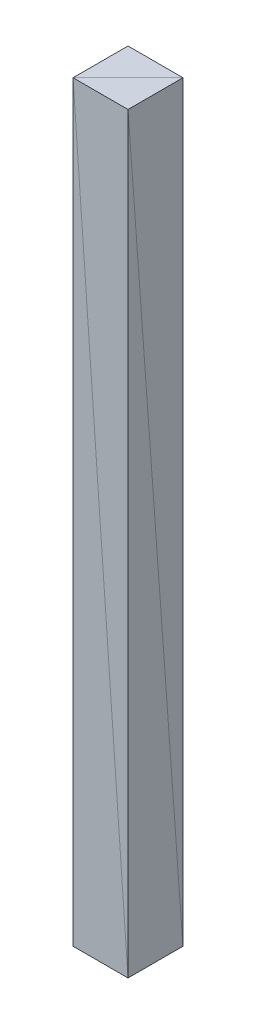
ISO-10303-21;
HEADER;
FILE_DESCRIPTION(('STEP AP214'),'2;1');
FILE_NAME('part.step','',(''),(''),'','','');
FILE_SCHEMA(('AUTOMOTIVE_DESIGN { 1 0 10303 214 1 1 1 1 }'));
ENDSEC;
DATA;
#1=APPLICATION_CONTEXT('core data for automotive mechanical design processes');
#2=APPLICATION_PROTOCOL_DEFINITION('international standard','automotive_design',2000,#1);
#3=PRODUCT_CONTEXT('',#1,'mechanical');
#4=PRODUCT('Part','Part','',(#3));
#5=PRODUCT_RELATED_PRODUCT_CATEGORY('part','',(#4));
#6=PRODUCT_DEFINITION_FORMATION('','',#4);
#7=PRODUCT_DEFINITION_CONTEXT('part definition',#1,'design');
#8=PRODUCT_DEFINITION('design','',#6,#7);
#9=PRODUCT_DEFINITION_SHAPE('','',#8);
#10=(LENGTH_UNIT() NAMED_UNIT(*) SI_UNIT(.MILLI.,.METRE.));
#11=(NAMED_UNIT(*) PLANE_ANGLE_UNIT() SI_UNIT($,.RADIAN.));
#12=(NAMED_UNIT(*) SI_UNIT($,.STERADIAN.) SOLID_ANGLE_UNIT());
#13=UNCERTAINTY_MEASURE_WITH_UNIT(LENGTH_MEASURE(1.E-05),#10,'distance_accuracy_value','');
#14=(GEOMETRIC_REPRESENTATION_CONTEXT(3) GLOBAL_UNCERTAINTY_ASSIGNED_CONTEXT((#13)) GLOBAL_UNIT_ASSIGNED_CONTEXT((#10,
#11,#12)) REPRESENTATION_CONTEXT('',''));
#15=CARTESIAN_POINT('',(0.,0.,0.));
#16=DIRECTION('',(0.,0.,1.));
#17=DIRECTION('',(1.,0.,0.));
#18=AXIS2_PLACEMENT_3D('',#15,#16,#17);
#19=CARTESIAN_POINT('',(0.,0.,0.));
#20=DIRECTION('',(0.,-1.,0.));
#21=DIRECTION('',(0.,0.,-1.));
#22=AXIS2_PLACEMENT_3D('',#19,#20,#21);
#23=PLANE('',#22);
#24=DIRECTION('',(1.,0.,0.));
#25=VECTOR('',#24,1.);
#26=CARTESIAN_POINT('',(0.,0.,9.4999996945262));
#27=LINE('',#26,#25);
#28=CARTESIAN_POINT('',(0.,0.,9.4999996945262));
#29=VERTEX_POINT('',#28);
#30=CARTESIAN_POINT('',(9.4999996945262,0.,9.4999996945262));
#31=VERTEX_POINT('',#30);
#32=EDGE_CURVE('E19',#29,#31,#27,.T.);
#33=ORIENTED_EDGE('',*,*,#32,.F.);
#34=DIRECTION('',(0.,0.,1.));
#35=VECTOR('',#34,1.);
#36=CARTESIAN_POINT('',(0.,0.,0.));
#37=LINE('',#36,#35);
#38=CARTESIAN_POINT('',(0.,0.,0.));
#39=VERTEX_POINT('',#38);
#40=EDGE_CURVE('E59',#39,#29,#37,.T.);
#41=ORIENTED_EDGE('',*,*,#40,.F.);
#42=DIRECTION('',(-0.707106781186548,0.,-0.707106781186548));
#43=VECTOR('',#42,1.);
#44=CARTESIAN_POINT('',(9.4999996945262,0.,9.4999996945262));
#45=LINE('',#44,#43);
#46=EDGE_CURVE('E75',#31,#39,#45,.T.);
#47=ORIENTED_EDGE('',*,*,#46,.F.);
#48=EDGE_LOOP('',(#33,#41,#47));
#49=FACE_BOUND('',#48,.T.);
#50=ADVANCED_FACE('F16',(#49),#23,.T.);
#51=CARTESIAN_POINT('',(0.,0.,9.4999996945262));
#52=DIRECTION('',(0.,0.,-1.));
#53=DIRECTION('',(-1.,0.,0.));
#54=AXIS2_PLACEMENT_3D('',#51,#52,#53);
#55=PLANE('',#54);
#56=ORIENTED_EDGE('',*,*,#32,.T.);
#57=DIRECTION('',(0.0728825774168715,-0.997340528560368,0.));
#58=VECTOR('',#57,1.);
#59=CARTESIAN_POINT('',(0.,129.999995231628,9.4999996945262));
#60=LINE('',#59,#58);
#61=CARTESIAN_POINT('',(0.,129.999995231628,9.4999996945262));
#62=VERTEX_POINT('',#61);
#63=EDGE_CURVE('E86',#62,#31,#60,.T.);
#64=ORIENTED_EDGE('',*,*,#63,.F.);
#65=DIRECTION('',(0.,1.,0.));
#66=VECTOR('',#65,1.);
#67=CARTESIAN_POINT('',(0.,0.,9.4999996945262));
#68=LINE('',#67,#66);
#69=EDGE_CURVE('E72',#29,#62,#68,.T.);
#70=ORIENTED_EDGE('',*,*,#69,.F.);
#71=EDGE_LOOP('',(#56,#64,#70));
#72=FACE_BOUND('',#71,.T.);
#73=ADVANCED_FACE('F149',(#72),#55,.F.);
#74=CARTESIAN_POINT('',(0.,0.,0.));
#75=DIRECTION('',(1.,0.,0.));
#76=DIRECTION('',(0.,0.,-1.));
#77=AXIS2_PLACEMENT_3D('',#74,#75,#76);
#78=PLANE('',#77);
#79=ORIENTED_EDGE('',*,*,#40,.T.);
#80=DIRECTION('',(0.,-0.997340528560368,0.0728825774168715));
#81=VECTOR('',#80,1.);
#82=CARTESIAN_POINT('',(0.,129.999995231628,0.));
#83=LINE('',#82,#81);
#84=CARTESIAN_POINT('',(0.,129.999995231628,0.));
#85=VERTEX_POINT('',#84);
#86=EDGE_CURVE('E58',#85,#29,#83,.T.);
#87=ORIENTED_EDGE('',*,*,#86,.F.);
#88=DIRECTION('',(0.,1.,0.));
#89=VECTOR('',#88,1.);
#90=CARTESIAN_POINT('',(0.,0.,0.));
#91=LINE('',#90,#89);
#92=EDGE_CURVE('E54',#39,#85,#91,.T.);
#93=ORIENTED_EDGE('',*,*,#92,.F.);
#94=EDGE_LOOP('',(#79,#87,#93));
#95=FACE_BOUND('',#94,.T.);
#96=ADVANCED_FACE('F60',(#95),#78,.F.);
#97=CARTESIAN_POINT('',(0.,0.,0.));
#98=DIRECTION('',(-1.,0.,0.));
#99=DIRECTION('',(0.,0.,1.));
#100=AXIS2_PLACEMENT_3D('',#97,#98,#99);
#101=PLANE('',#100);
#102=ORIENTED_EDGE('',*,*,#69,.T.);
#103=DIRECTION('',(0.,0.,1.));
#104=VECTOR('',#103,1.);
#105=CARTESIAN_POINT('',(0.,129.999995231628,0.));
#106=LINE('',#105,#104);
#107=EDGE_CURVE('E81',#85,#62,#106,.T.);
#108=ORIENTED_EDGE('',*,*,#107,.F.);
#109=ORIENTED_EDGE('',*,*,#86,.T.);
#110=EDGE_LOOP('',(#102,#108,#109));
#111=FACE_BOUND('',#110,.T.);
#112=ADVANCED_FACE('F97',(#111),#101,.T.);
#113=CARTESIAN_POINT('',(0.,0.,0.));
#114=DIRECTION('',(0.,1.,0.));
#115=DIRECTION('',(0.,0.,1.));
#116=AXIS2_PLACEMENT_3D('',#113,#114,#115);
#117=PLANE('',#116);
#118=DIRECTION('',(0.,0.,-1.));
#119=VECTOR('',#118,1.);
#120=CARTESIAN_POINT('',(9.4999996945262,0.,9.4999996945262));
#121=LINE('',#120,#119);
#122=CARTESIAN_POINT('',(9.4999996945262,0.,0.));
#123=VERTEX_POINT('',#122);
#124=EDGE_CURVE('E78',#31,#123,#121,.T.);
#125=ORIENTED_EDGE('',*,*,#124,.F.);
#126=ORIENTED_EDGE('',*,*,#46,.T.);
#127=DIRECTION('',(-1.,0.,0.));
#128=VECTOR('',#127,1.);
#129=CARTESIAN_POINT('',(9.4999996945262,0.,0.));
#130=LINE('',#129,#128);
#131=EDGE_CURVE('E66',#123,#39,#130,.T.);
#132=ORIENTED_EDGE('',*,*,#131,.F.);
#133=EDGE_LOOP('',(#125,#126,#132));
#134=FACE_BOUND('',#133,.T.);
#135=ADVANCED_FACE('F80',(#134),#117,.F.);
#136=CARTESIAN_POINT('',(0.,129.999995231628,0.));
#137=DIRECTION('',(0.,1.,0.));
#138=DIRECTION('',(0.,0.,1.));
#139=AXIS2_PLACEMENT_3D('',#136,#137,#138);
#140=PLANE('',#139);
#141=DIRECTION('',(1.,0.,0.));
#142=VECTOR('',#141,1.);
#143=CARTESIAN_POINT('',(0.,129.999995231628,0.));
#144=LINE('',#143,#142);
#145=CARTESIAN_POINT('',(9.4999996945262,129.999995231628,0.));
#146=VERTEX_POINT('',#145);
#147=EDGE_CURVE('E65',#85,#146,#144,.T.);
#148=ORIENTED_EDGE('',*,*,#147,.F.);
#149=ORIENTED_EDGE('',*,*,#107,.T.);
#150=DIRECTION('',(-0.707106781186548,0.,0.707106781186548));
#151=VECTOR('',#150,1.);
#152=CARTESIAN_POINT('',(9.4999996945262,129.999995231628,0.));
#153=LINE('',#152,#151);
#154=EDGE_CURVE('E106',#146,#62,#153,.T.);
#155=ORIENTED_EDGE('',*,*,#154,.F.);
#156=EDGE_LOOP('',(#148,#149,#155));
#157=FACE_BOUND('',#156,.T.);
#158=ADVANCED_FACE('F102',(#157),#140,.T.);
#159=CARTESIAN_POINT('',(0.,0.,0.));
#160=DIRECTION('',(0.,0.,1.));
#161=DIRECTION('',(1.,0.,0.));
#162=AXIS2_PLACEMENT_3D('',#159,#160,#161);
#163=PLANE('',#162);
#164=ORIENTED_EDGE('',*,*,#131,.T.);
#165=DIRECTION('',(-0.0728825774168715,-0.997340528560368,0.));
#166=VECTOR('',#165,1.);
#167=CARTESIAN_POINT('',(9.4999996945262,129.999995231628,0.));
#168=LINE('',#167,#166);
#169=EDGE_CURVE('E82',#146,#39,#168,.T.);
#170=ORIENTED_EDGE('',*,*,#169,.F.);
#171=DIRECTION('',(0.,1.,0.));
#172=VECTOR('',#171,1.);
#173=CARTESIAN_POINT('',(9.4999996945262,0.,0.));
#174=LINE('',#173,#172);
#175=EDGE_CURVE('E35',#123,#146,#174,.T.);
#176=ORIENTED_EDGE('',*,*,#175,.F.);
#177=EDGE_LOOP('',(#164,#170,#176));
#178=FACE_BOUND('',#177,.T.);
#179=ADVANCED_FACE('F83',(#178),#163,.F.);
#180=CARTESIAN_POINT('',(0.,0.,0.));
#181=DIRECTION('',(0.,0.,-1.));
#182=DIRECTION('',(-1.,0.,0.));
#183=AXIS2_PLACEMENT_3D('',#180,#181,#182);
#184=PLANE('',#183);
#185=ORIENTED_EDGE('',*,*,#92,.T.);
#186=ORIENTED_EDGE('',*,*,#147,.T.);
#187=ORIENTED_EDGE('',*,*,#169,.T.);
#188=EDGE_LOOP('',(#185,#186,#187));
#189=FACE_BOUND('',#188,.T.);
#190=ADVANCED_FACE('F87',(#189),#184,.T.);
#191=CARTESIAN_POINT('',(0.,0.,9.4999996945262));
#192=DIRECTION('',(0.,0.,1.));
#193=DIRECTION('',(1.,0.,0.));
#194=AXIS2_PLACEMENT_3D('',#191,#192,#193);
#195=PLANE('',#194);
#196=DIRECTION('',(0.,-1.,0.));
#197=VECTOR('',#196,1.);
#198=CARTESIAN_POINT('',(9.4999996945262,129.999995231628,9.4999996945262));
#199=LINE('',#198,#197);
#200=CARTESIAN_POINT('',(9.4999996945262,129.999995231628,9.4999996945262));
#201=VERTEX_POINT('',#200);
#202=EDGE_CURVE('E112',#201,#31,#199,.T.);
#203=ORIENTED_EDGE('',*,*,#202,.F.);
#204=DIRECTION('',(1.,0.,0.));
#205=VECTOR('',#204,1.);
#206=CARTESIAN_POINT('',(0.,129.999995231628,9.4999996945262));
#207=LINE('',#206,#205);
#208=EDGE_CURVE('E89',#62,#201,#207,.T.);
#209=ORIENTED_EDGE('',*,*,#208,.F.);
#210=ORIENTED_EDGE('',*,*,#63,.T.);
#211=EDGE_LOOP('',(#203,#209,#210));
#212=FACE_BOUND('',#211,.T.);
#213=ADVANCED_FACE('F108',(#212),#195,.T.);
#214=CARTESIAN_POINT('',(0.,129.999995231628,0.));
#215=DIRECTION('',(0.,-1.,0.));
#216=DIRECTION('',(0.,0.,-1.));
#217=AXIS2_PLACEMENT_3D('',#214,#215,#216);
#218=PLANE('',#217);
#219=DIRECTION('',(0.,0.,1.));
#220=VECTOR('',#219,1.);
#221=CARTESIAN_POINT('',(9.4999996945262,129.999995231628,0.));
#222=LINE('',#221,#220);
#223=EDGE_CURVE('E25',#146,#201,#222,.T.);
#224=ORIENTED_EDGE('',*,*,#223,.F.);
#225=ORIENTED_EDGE('',*,*,#154,.T.);
#226=ORIENTED_EDGE('',*,*,#208,.T.);
#227=EDGE_LOOP('',(#224,#225,#226));
#228=FACE_BOUND('',#227,.T.);
#229=ADVANCED_FACE('F113',(#228),#218,.F.);
#230=CARTESIAN_POINT('',(9.4999996945262,0.,0.));
#231=DIRECTION('',(-1.,0.,0.));
#232=DIRECTION('',(0.,0.,1.));
#233=AXIS2_PLACEMENT_3D('',#230,#231,#232);
#234=PLANE('',#233);
#235=ORIENTED_EDGE('',*,*,#124,.T.);
#236=DIRECTION('',(0.,-0.997340528560368,-0.0728825774168715));
#237=VECTOR('',#236,1.);
#238=CARTESIAN_POINT('',(9.4999996945262,129.999995231628,9.4999996945262));
#239=LINE('',#238,#237);
#240=EDGE_CURVE('E10',#201,#123,#239,.T.);
#241=ORIENTED_EDGE('',*,*,#240,.F.);
#242=ORIENTED_EDGE('',*,*,#202,.T.);
#243=EDGE_LOOP('',(#235,#241,#242));
#244=FACE_BOUND('',#243,.T.);
#245=ADVANCED_FACE('F124',(#244),#234,.F.);
#246=CARTESIAN_POINT('',(9.4999996945262,0.,0.));
#247=DIRECTION('',(1.,0.,0.));
#248=DIRECTION('',(0.,0.,-1.));
#249=AXIS2_PLACEMENT_3D('',#246,#247,#248);
#250=PLANE('',#249);
#251=ORIENTED_EDGE('',*,*,#175,.T.);
#252=ORIENTED_EDGE('',*,*,#223,.T.);
#253=ORIENTED_EDGE('',*,*,#240,.T.);
#254=EDGE_LOOP('',(#251,#252,#253));
#255=FACE_BOUND('',#254,.T.);
#256=ADVANCED_FACE('F123',(#255),#250,.T.);
#257=CLOSED_SHELL('',(#50,#73,#96,#112,#135,#158,#179,#190,#213,#229,#245,#256));
#258=MANIFOLD_SOLID_BREP('B1',#257);
#259=ADVANCED_BREP_SHAPE_REPRESENTATION('',(#18,#258),#14);
#260=SHAPE_DEFINITION_REPRESENTATION(#9,#259);
ENDSEC;
END-ISO-10303-21;
